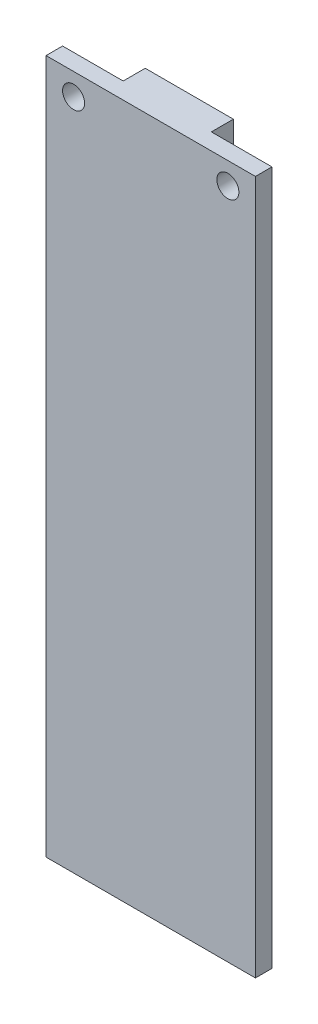
ISO-10303-21;
HEADER;
FILE_DESCRIPTION(('STEP AP214'),'2;1');
FILE_NAME('part.step','',(''),(''),'','','');
FILE_SCHEMA(('AUTOMOTIVE_DESIGN { 1 0 10303 214 1 1 1 1 }'));
ENDSEC;
DATA;
#1=APPLICATION_CONTEXT('core data for automotive mechanical design processes');
#2=APPLICATION_PROTOCOL_DEFINITION('international standard','automotive_design',2000,#1);
#3=PRODUCT_CONTEXT('',#1,'mechanical');
#4=PRODUCT('Part','Part','',(#3));
#5=PRODUCT_RELATED_PRODUCT_CATEGORY('part','',(#4));
#6=PRODUCT_DEFINITION_FORMATION('','',#4);
#7=PRODUCT_DEFINITION_CONTEXT('part definition',#1,'design');
#8=PRODUCT_DEFINITION('design','',#6,#7);
#9=PRODUCT_DEFINITION_SHAPE('','',#8);
#10=(LENGTH_UNIT() NAMED_UNIT(*) SI_UNIT(.MILLI.,.METRE.));
#11=(NAMED_UNIT(*) PLANE_ANGLE_UNIT() SI_UNIT($,.RADIAN.));
#12=(NAMED_UNIT(*) SI_UNIT($,.STERADIAN.) SOLID_ANGLE_UNIT());
#13=UNCERTAINTY_MEASURE_WITH_UNIT(LENGTH_MEASURE(1.E-05),#10,'distance_accuracy_value','');
#14=(GEOMETRIC_REPRESENTATION_CONTEXT(3) GLOBAL_UNCERTAINTY_ASSIGNED_CONTEXT((#13)) GLOBAL_UNIT_ASSIGNED_CONTEXT((#10,
#11,#12)) REPRESENTATION_CONTEXT('',''));
#15=CARTESIAN_POINT('',(0.,0.,0.));
#16=DIRECTION('',(0.,0.,1.));
#17=DIRECTION('',(1.,0.,0.));
#18=AXIS2_PLACEMENT_3D('',#15,#16,#17);
#19=CARTESIAN_POINT('',(0.,0.,1.5));
#20=DIRECTION('',(0.,0.,-1.));
#21=DIRECTION('',(-1.,0.,0.));
#22=AXIS2_PLACEMENT_3D('',#19,#20,#21);
#23=PLANE('',#22);
#24=DIRECTION('',(0.,1.,0.));
#25=VECTOR('',#24,1.);
#26=CARTESIAN_POINT('',(9.50000000000001,-31.5,1.5));
#27=LINE('',#26,#25);
#28=CARTESIAN_POINT('',(9.50000000000001,-31.5,1.5));
#29=VERTEX_POINT('',#28);
#30=CARTESIAN_POINT('',(9.50000000000001,31.5,1.5));
#31=VERTEX_POINT('',#30);
#32=EDGE_CURVE('E154',#29,#31,#27,.T.);
#33=ORIENTED_EDGE('',*,*,#32,.T.);
#34=DIRECTION('',(-1.,0.,0.));
#35=VECTOR('',#34,1.);
#36=CARTESIAN_POINT('',(-9.49999999999999,31.5,1.5));
#37=LINE('',#36,#35);
#38=CARTESIAN_POINT('',(-9.49999999999999,31.5,1.5));
#39=VERTEX_POINT('',#38);
#40=EDGE_CURVE('E157',#31,#39,#37,.T.);
#41=ORIENTED_EDGE('',*,*,#40,.T.);
#42=DIRECTION('',(0.,-1.,0.));
#43=VECTOR('',#42,1.);
#44=CARTESIAN_POINT('',(-9.49999999999999,-31.5,1.5));
#45=LINE('',#44,#43);
#46=CARTESIAN_POINT('',(-9.49999999999999,-31.5,1.5));
#47=VERTEX_POINT('',#46);
#48=EDGE_CURVE('E160',#39,#47,#45,.T.);
#49=ORIENTED_EDGE('',*,*,#48,.T.);
#50=DIRECTION('',(1.,0.,0.));
#51=VECTOR('',#50,1.);
#52=CARTESIAN_POINT('',(-9.49999999999999,-31.5,1.5));
#53=LINE('',#52,#51);
#54=EDGE_CURVE('E162',#47,#29,#53,.T.);
#55=ORIENTED_EDGE('',*,*,#54,.T.);
#56=EDGE_LOOP('',(#33,#41,#49,#55));
#57=FACE_BOUND('',#56,.T.);
#58=CARTESIAN_POINT('',(-7.,29.5,1.5));
#59=DIRECTION('',(0.,0.,1.));
#60=DIRECTION('',(1.,0.,0.));
#61=AXIS2_PLACEMENT_3D('',#58,#59,#60);
#62=CIRCLE('',#61,1.);
#63=CARTESIAN_POINT('',(-6.,29.5,1.5));
#64=VERTEX_POINT('',#63);
#65=EDGE_CURVE('E148',#64,#64,#62,.T.);
#66=ORIENTED_EDGE('',*,*,#65,.F.);
#67=EDGE_LOOP('',(#66));
#68=FACE_BOUND('',#67,.T.);
#69=CARTESIAN_POINT('',(7.,29.5,1.5));
#70=DIRECTION('',(0.,0.,1.));
#71=DIRECTION('',(-1.,0.,0.));
#72=AXIS2_PLACEMENT_3D('',#69,#70,#71);
#73=CIRCLE('',#72,1.);
#74=CARTESIAN_POINT('',(6.,29.5,1.5));
#75=VERTEX_POINT('',#74);
#76=EDGE_CURVE('E139',#75,#75,#73,.T.);
#77=ORIENTED_EDGE('',*,*,#76,.F.);
#78=EDGE_LOOP('',(#77));
#79=FACE_BOUND('',#78,.T.);
#80=ADVANCED_FACE('F37',(#57,#68,#79),#23,.F.);
#81=CARTESIAN_POINT('',(0.,0.,0.));
#82=DIRECTION('',(0.,0.,-1.));
#83=DIRECTION('',(-1.,0.,0.));
#84=AXIS2_PLACEMENT_3D('',#81,#82,#83);
#85=PLANE('',#84);
#86=DIRECTION('',(0.,1.,0.));
#87=VECTOR('',#86,1.);
#88=CARTESIAN_POINT('',(-4.,27.5,0.));
#89=LINE('',#88,#87);
#90=CARTESIAN_POINT('',(-4.,27.5,0.));
#91=VERTEX_POINT('',#90);
#92=CARTESIAN_POINT('',(-4.,31.5,0.));
#93=VERTEX_POINT('',#92);
#94=EDGE_CURVE('E52',#91,#93,#89,.T.);
#95=ORIENTED_EDGE('',*,*,#94,.F.);
#96=CARTESIAN_POINT('',(-3.,27.5,0.));
#97=DIRECTION('',(0.,0.,-1.));
#98=DIRECTION('',(-1.,0.,0.));
#99=AXIS2_PLACEMENT_3D('',#96,#97,#98);
#100=CIRCLE('',#99,1.);
#101=CARTESIAN_POINT('',(-2.99999999999999,26.5,0.));
#102=VERTEX_POINT('',#101);
#103=EDGE_CURVE('E56',#102,#91,#100,.T.);
#104=ORIENTED_EDGE('',*,*,#103,.F.);
#105=DIRECTION('',(-1.,0.,0.));
#106=VECTOR('',#105,1.);
#107=CARTESIAN_POINT('',(2.99999999999999,26.5,0.));
#108=LINE('',#107,#106);
#109=CARTESIAN_POINT('',(2.99999999999999,26.5,0.));
#110=VERTEX_POINT('',#109);
#111=EDGE_CURVE('E344',#110,#102,#108,.T.);
#112=ORIENTED_EDGE('',*,*,#111,.F.);
#113=CARTESIAN_POINT('',(3.,27.5,0.));
#114=DIRECTION('',(0.,0.,-1.));
#115=DIRECTION('',(-1.,0.,0.));
#116=AXIS2_PLACEMENT_3D('',#113,#114,#115);
#117=CIRCLE('',#116,1.);
#118=CARTESIAN_POINT('',(4.,27.5,0.));
#119=VERTEX_POINT('',#118);
#120=EDGE_CURVE('E347',#119,#110,#117,.T.);
#121=ORIENTED_EDGE('',*,*,#120,.F.);
#122=DIRECTION('',(0.,-1.,0.));
#123=VECTOR('',#122,1.);
#124=CARTESIAN_POINT('',(4.,31.5,0.));
#125=LINE('',#124,#123);
#126=CARTESIAN_POINT('',(4.,31.5,0.));
#127=VERTEX_POINT('',#126);
#128=EDGE_CURVE('E348',#127,#119,#125,.T.);
#129=ORIENTED_EDGE('',*,*,#128,.F.);
#130=DIRECTION('',(-1.,0.,0.));
#131=VECTOR('',#130,1.);
#132=CARTESIAN_POINT('',(-9.49999999999999,31.5,0.));
#133=LINE('',#132,#131);
#134=CARTESIAN_POINT('',(9.50000000000001,31.5,0.));
#135=VERTEX_POINT('',#134);
#136=EDGE_CURVE('E135',#135,#127,#133,.T.);
#137=ORIENTED_EDGE('',*,*,#136,.F.);
#138=DIRECTION('',(0.,1.,0.));
#139=VECTOR('',#138,1.);
#140=CARTESIAN_POINT('',(9.50000000000001,-31.5,0.));
#141=LINE('',#140,#139);
#142=CARTESIAN_POINT('',(9.50000000000001,-31.5,0.));
#143=VERTEX_POINT('',#142);
#144=EDGE_CURVE('E151',#143,#135,#141,.T.);
#145=ORIENTED_EDGE('',*,*,#144,.F.);
#146=DIRECTION('',(1.,0.,0.));
#147=VECTOR('',#146,1.);
#148=CARTESIAN_POINT('',(-9.49999999999999,-31.5,0.));
#149=LINE('',#148,#147);
#150=CARTESIAN_POINT('',(-9.49999999999999,-31.5,0.));
#151=VERTEX_POINT('',#150);
#152=EDGE_CURVE('E158',#151,#143,#149,.T.);
#153=ORIENTED_EDGE('',*,*,#152,.F.);
#154=DIRECTION('',(0.,-1.,0.));
#155=VECTOR('',#154,1.);
#156=CARTESIAN_POINT('',(-9.49999999999999,-31.5,0.));
#157=LINE('',#156,#155);
#158=CARTESIAN_POINT('',(-9.49999999999999,31.5,0.));
#159=VERTEX_POINT('',#158);
#160=EDGE_CURVE('E169',#159,#151,#157,.T.);
#161=ORIENTED_EDGE('',*,*,#160,.F.);
#162=EDGE_CURVE('E167',#93,#159,#133,.T.);
#163=ORIENTED_EDGE('',*,*,#162,.F.);
#164=EDGE_LOOP('',(#95,#104,#112,#121,#129,#137,#145,#153,#161,#163));
#165=FACE_BOUND('',#164,.T.);
#166=CARTESIAN_POINT('',(-7.,29.5,0.));
#167=DIRECTION('',(0.,0.,1.));
#168=DIRECTION('',(1.,0.,0.));
#169=AXIS2_PLACEMENT_3D('',#166,#167,#168);
#170=CIRCLE('',#169,1.);
#171=CARTESIAN_POINT('',(-6.,29.5,0.));
#172=VERTEX_POINT('',#171);
#173=EDGE_CURVE('E146',#172,#172,#170,.T.);
#174=ORIENTED_EDGE('',*,*,#173,.T.);
#175=EDGE_LOOP('',(#174));
#176=FACE_BOUND('',#175,.T.);
#177=CARTESIAN_POINT('',(7.,29.5,0.));
#178=DIRECTION('',(0.,0.,1.));
#179=DIRECTION('',(-1.,0.,0.));
#180=AXIS2_PLACEMENT_3D('',#177,#178,#179);
#181=CIRCLE('',#180,1.);
#182=CARTESIAN_POINT('',(6.,29.5,0.));
#183=VERTEX_POINT('',#182);
#184=EDGE_CURVE('E136',#183,#183,#181,.T.);
#185=ORIENTED_EDGE('',*,*,#184,.T.);
#186=EDGE_LOOP('',(#185));
#187=FACE_BOUND('',#186,.T.);
#188=ADVANCED_FACE('F184',(#165,#176,#187),#85,.T.);
#189=CARTESIAN_POINT('',(9.50000000000001,-31.5,1.5));
#190=DIRECTION('',(-1.,0.,0.));
#191=DIRECTION('',(0.,0.,1.));
#192=AXIS2_PLACEMENT_3D('',#189,#190,#191);
#193=PLANE('',#192);
#194=ORIENTED_EDGE('',*,*,#144,.T.);
#195=DIRECTION('',(0.,0.,-1.));
#196=VECTOR('',#195,1.);
#197=CARTESIAN_POINT('',(9.50000000000001,31.5,1.5));
#198=LINE('',#197,#196);
#199=EDGE_CURVE('E11',#31,#135,#198,.T.);
#200=ORIENTED_EDGE('',*,*,#199,.F.);
#201=ORIENTED_EDGE('',*,*,#32,.F.);
#202=DIRECTION('',(0.,0.,-1.));
#203=VECTOR('',#202,1.);
#204=CARTESIAN_POINT('',(9.50000000000001,-31.5,1.5));
#205=LINE('',#204,#203);
#206=EDGE_CURVE('E164',#29,#143,#205,.T.);
#207=ORIENTED_EDGE('',*,*,#206,.T.);
#208=EDGE_LOOP('',(#194,#200,#201,#207));
#209=FACE_BOUND('',#208,.T.);
#210=ADVANCED_FACE('F39',(#209),#193,.F.);
#211=CARTESIAN_POINT('',(-9.49999999999999,31.5,1.5));
#212=DIRECTION('',(0.,-1.,0.));
#213=DIRECTION('',(0.,0.,-1.));
#214=AXIS2_PLACEMENT_3D('',#211,#212,#213);
#215=PLANE('',#214);
#216=ORIENTED_EDGE('',*,*,#136,.T.);
#217=DIRECTION('',(0.,0.,1.));
#218=VECTOR('',#217,1.);
#219=CARTESIAN_POINT('',(4.,31.5,-2.));
#220=LINE('',#219,#218);
#221=CARTESIAN_POINT('',(4.,31.5,-2.));
#222=VERTEX_POINT('',#221);
#223=EDGE_CURVE('E117',#222,#127,#220,.T.);
#224=ORIENTED_EDGE('',*,*,#223,.F.);
#225=DIRECTION('',(1.,0.,0.));
#226=VECTOR('',#225,1.);
#227=CARTESIAN_POINT('',(-4.,31.5,-2.));
#228=LINE('',#227,#226);
#229=CARTESIAN_POINT('',(-4.,31.5,-2.));
#230=VERTEX_POINT('',#229);
#231=EDGE_CURVE('E123',#230,#222,#228,.T.);
#232=ORIENTED_EDGE('',*,*,#231,.F.);
#233=DIRECTION('',(0.,0.,1.));
#234=VECTOR('',#233,1.);
#235=CARTESIAN_POINT('',(-4.,31.5,-2.));
#236=LINE('',#235,#234);
#237=EDGE_CURVE('E328',#230,#93,#236,.T.);
#238=ORIENTED_EDGE('',*,*,#237,.T.);
#239=ORIENTED_EDGE('',*,*,#162,.T.);
#240=DIRECTION('',(0.,0.,-1.));
#241=VECTOR('',#240,1.);
#242=CARTESIAN_POINT('',(-9.49999999999999,31.5,1.5));
#243=LINE('',#242,#241);
#244=EDGE_CURVE('E45',#39,#159,#243,.T.);
#245=ORIENTED_EDGE('',*,*,#244,.F.);
#246=ORIENTED_EDGE('',*,*,#40,.F.);
#247=ORIENTED_EDGE('',*,*,#199,.T.);
#248=EDGE_LOOP('',(#216,#224,#232,#238,#239,#245,#246,#247));
#249=FACE_BOUND('',#248,.T.);
#250=ADVANCED_FACE('F134',(#249),#215,.F.);
#251=CARTESIAN_POINT('',(-9.49999999999999,-31.5,1.5));
#252=DIRECTION('',(1.,0.,0.));
#253=DIRECTION('',(0.,0.,-1.));
#254=AXIS2_PLACEMENT_3D('',#251,#252,#253);
#255=PLANE('',#254);
#256=ORIENTED_EDGE('',*,*,#160,.T.);
#257=DIRECTION('',(0.,0.,-1.));
#258=VECTOR('',#257,1.);
#259=CARTESIAN_POINT('',(-9.49999999999999,-31.5,1.5));
#260=LINE('',#259,#258);
#261=EDGE_CURVE('E174',#47,#151,#260,.T.);
#262=ORIENTED_EDGE('',*,*,#261,.F.);
#263=ORIENTED_EDGE('',*,*,#48,.F.);
#264=ORIENTED_EDGE('',*,*,#244,.T.);
#265=EDGE_LOOP('',(#256,#262,#263,#264));
#266=FACE_BOUND('',#265,.T.);
#267=ADVANCED_FACE('F181',(#266),#255,.F.);
#268=CARTESIAN_POINT('',(-9.49999999999999,-31.5,1.5));
#269=DIRECTION('',(0.,1.,0.));
#270=DIRECTION('',(0.,0.,1.));
#271=AXIS2_PLACEMENT_3D('',#268,#269,#270);
#272=PLANE('',#271);
#273=ORIENTED_EDGE('',*,*,#152,.T.);
#274=ORIENTED_EDGE('',*,*,#206,.F.);
#275=ORIENTED_EDGE('',*,*,#54,.F.);
#276=ORIENTED_EDGE('',*,*,#261,.T.);
#277=EDGE_LOOP('',(#273,#274,#275,#276));
#278=FACE_BOUND('',#277,.T.);
#279=ADVANCED_FACE('F189',(#278),#272,.F.);
#280=CARTESIAN_POINT('',(-7.,29.5,1.5));
#281=DIRECTION('',(0.,0.,-1.));
#282=DIRECTION('',(-1.,0.,0.));
#283=AXIS2_PLACEMENT_3D('',#280,#281,#282);
#284=CYLINDRICAL_SURFACE('',#283,1.);
#285=ORIENTED_EDGE('',*,*,#65,.T.);
#286=EDGE_LOOP('',(#285));
#287=FACE_BOUND('',#286,.T.);
#288=ORIENTED_EDGE('',*,*,#173,.F.);
#289=EDGE_LOOP('',(#288));
#290=FACE_BOUND('',#289,.T.);
#291=ADVANCED_FACE('F205',(#287,#290),#284,.F.);
#292=CARTESIAN_POINT('',(7.,29.5,1.5));
#293=DIRECTION('',(0.,0.,-1.));
#294=DIRECTION('',(-1.,0.,0.));
#295=AXIS2_PLACEMENT_3D('',#292,#293,#294);
#296=CYLINDRICAL_SURFACE('',#295,1.);
#297=ORIENTED_EDGE('',*,*,#76,.T.);
#298=EDGE_LOOP('',(#297));
#299=FACE_BOUND('',#298,.T.);
#300=ORIENTED_EDGE('',*,*,#184,.F.);
#301=EDGE_LOOP('',(#300));
#302=FACE_BOUND('',#301,.T.);
#303=ADVANCED_FACE('F202',(#299,#302),#296,.F.);
#304=CARTESIAN_POINT('',(4.,31.5,-2.));
#305=DIRECTION('',(-1.,0.,0.));
#306=DIRECTION('',(0.,0.,1.));
#307=AXIS2_PLACEMENT_3D('',#304,#305,#306);
#308=PLANE('',#307);
#309=ORIENTED_EDGE('',*,*,#128,.T.);
#310=DIRECTION('',(0.,0.,1.));
#311=VECTOR('',#310,1.);
#312=CARTESIAN_POINT('',(4.,27.5,-2.));
#313=LINE('',#312,#311);
#314=CARTESIAN_POINT('',(4.,27.5,-2.));
#315=VERTEX_POINT('',#314);
#316=EDGE_CURVE('E119',#315,#119,#313,.T.);
#317=ORIENTED_EDGE('',*,*,#316,.F.);
#318=DIRECTION('',(0.,-1.,0.));
#319=VECTOR('',#318,1.);
#320=CARTESIAN_POINT('',(4.,31.5,-2.));
#321=LINE('',#320,#319);
#322=EDGE_CURVE('E112',#222,#315,#321,.T.);
#323=ORIENTED_EDGE('',*,*,#322,.F.);
#324=ORIENTED_EDGE('',*,*,#223,.T.);
#325=EDGE_LOOP('',(#309,#317,#323,#324));
#326=FACE_BOUND('',#325,.T.);
#327=ADVANCED_FACE('F115',(#326),#308,.F.);
#328=CARTESIAN_POINT('',(3.,27.5,-2.));
#329=DIRECTION('',(0.,0.,1.));
#330=DIRECTION('',(1.,0.,0.));
#331=AXIS2_PLACEMENT_3D('',#328,#329,#330);
#332=CYLINDRICAL_SURFACE('',#331,1.);
#333=ORIENTED_EDGE('',*,*,#120,.T.);
#334=DIRECTION('',(0.,0.,1.));
#335=VECTOR('',#334,1.);
#336=CARTESIAN_POINT('',(2.99999999999999,26.5,-2.));
#337=LINE('',#336,#335);
#338=CARTESIAN_POINT('',(2.99999999999999,26.5,-2.));
#339=VERTEX_POINT('',#338);
#340=EDGE_CURVE('E141',#339,#110,#337,.T.);
#341=ORIENTED_EDGE('',*,*,#340,.F.);
#342=CARTESIAN_POINT('',(3.,27.5,-2.));
#343=DIRECTION('',(0.,0.,-1.));
#344=DIRECTION('',(-1.,0.,0.));
#345=AXIS2_PLACEMENT_3D('',#342,#343,#344);
#346=CIRCLE('',#345,1.);
#347=EDGE_CURVE('E122',#315,#339,#346,.T.);
#348=ORIENTED_EDGE('',*,*,#347,.F.);
#349=ORIENTED_EDGE('',*,*,#316,.T.);
#350=EDGE_LOOP('',(#333,#341,#348,#349));
#351=FACE_BOUND('',#350,.T.);
#352=ADVANCED_FACE('F248',(#351),#332,.T.);
#353=CARTESIAN_POINT('',(2.99999999999999,26.5,-2.));
#354=DIRECTION('',(0.,1.,0.));
#355=DIRECTION('',(0.,0.,1.));
#356=AXIS2_PLACEMENT_3D('',#353,#354,#355);
#357=PLANE('',#356);
#358=ORIENTED_EDGE('',*,*,#111,.T.);
#359=DIRECTION('',(0.,0.,1.));
#360=VECTOR('',#359,1.);
#361=CARTESIAN_POINT('',(-2.99999999999999,26.5,-2.));
#362=LINE('',#361,#360);
#363=CARTESIAN_POINT('',(-2.99999999999999,26.5,-2.));
#364=VERTEX_POINT('',#363);
#365=EDGE_CURVE('E333',#364,#102,#362,.T.);
#366=ORIENTED_EDGE('',*,*,#365,.F.);
#367=DIRECTION('',(-1.,0.,0.));
#368=VECTOR('',#367,1.);
#369=CARTESIAN_POINT('',(2.99999999999999,26.5,-2.));
#370=LINE('',#369,#368);
#371=EDGE_CURVE('E345',#339,#364,#370,.T.);
#372=ORIENTED_EDGE('',*,*,#371,.F.);
#373=ORIENTED_EDGE('',*,*,#340,.T.);
#374=EDGE_LOOP('',(#358,#366,#372,#373));
#375=FACE_BOUND('',#374,.T.);
#376=ADVANCED_FACE('F255',(#375),#357,.F.);
#377=CARTESIAN_POINT('',(-3.,27.5,-2.));
#378=DIRECTION('',(0.,0.,1.));
#379=DIRECTION('',(1.,0.,0.));
#380=AXIS2_PLACEMENT_3D('',#377,#378,#379);
#381=CYLINDRICAL_SURFACE('',#380,1.);
#382=ORIENTED_EDGE('',*,*,#103,.T.);
#383=DIRECTION('',(0.,0.,1.));
#384=VECTOR('',#383,1.);
#385=CARTESIAN_POINT('',(-4.,27.5,-2.));
#386=LINE('',#385,#384);
#387=CARTESIAN_POINT('',(-4.,27.5,-2.));
#388=VERTEX_POINT('',#387);
#389=EDGE_CURVE('E330',#388,#91,#386,.T.);
#390=ORIENTED_EDGE('',*,*,#389,.F.);
#391=CARTESIAN_POINT('',(-3.,27.5,-2.));
#392=DIRECTION('',(0.,0.,-1.));
#393=DIRECTION('',(-1.,0.,0.));
#394=AXIS2_PLACEMENT_3D('',#391,#392,#393);
#395=CIRCLE('',#394,1.);
#396=EDGE_CURVE('E335',#364,#388,#395,.T.);
#397=ORIENTED_EDGE('',*,*,#396,.F.);
#398=ORIENTED_EDGE('',*,*,#365,.T.);
#399=EDGE_LOOP('',(#382,#390,#397,#398));
#400=FACE_BOUND('',#399,.T.);
#401=ADVANCED_FACE('F263',(#400),#381,.T.);
#402=CARTESIAN_POINT('',(-4.,27.5,-2.));
#403=DIRECTION('',(1.,0.,0.));
#404=DIRECTION('',(0.,0.,-1.));
#405=AXIS2_PLACEMENT_3D('',#402,#403,#404);
#406=PLANE('',#405);
#407=ORIENTED_EDGE('',*,*,#94,.T.);
#408=ORIENTED_EDGE('',*,*,#237,.F.);
#409=DIRECTION('',(0.,1.,0.));
#410=VECTOR('',#409,1.);
#411=CARTESIAN_POINT('',(-4.,27.5,-2.));
#412=LINE('',#411,#410);
#413=EDGE_CURVE('E128',#388,#230,#412,.T.);
#414=ORIENTED_EDGE('',*,*,#413,.F.);
#415=ORIENTED_EDGE('',*,*,#389,.T.);
#416=EDGE_LOOP('',(#407,#408,#414,#415));
#417=FACE_BOUND('',#416,.T.);
#418=ADVANCED_FACE('F271',(#417),#406,.F.);
#419=CARTESIAN_POINT('',(3.,27.5,-2.));
#420=DIRECTION('',(0.,0.,-1.));
#421=DIRECTION('',(-1.,0.,0.));
#422=AXIS2_PLACEMENT_3D('',#419,#420,#421);
#423=PLANE('',#422);
#424=ORIENTED_EDGE('',*,*,#231,.T.);
#425=ORIENTED_EDGE('',*,*,#322,.T.);
#426=ORIENTED_EDGE('',*,*,#347,.T.);
#427=ORIENTED_EDGE('',*,*,#371,.T.);
#428=ORIENTED_EDGE('',*,*,#396,.T.);
#429=ORIENTED_EDGE('',*,*,#413,.T.);
#430=EDGE_LOOP('',(#424,#425,#426,#427,#428,#429));
#431=FACE_BOUND('',#430,.T.);
#432=ADVANCED_FACE('F126',(#431),#423,.T.);
#433=CLOSED_SHELL('',(#80,#188,#210,#250,#267,#279,#291,#303,#327,#352,#376,#401,#418,#432));
#434=MANIFOLD_SOLID_BREP('B2',#433);
#435=ADVANCED_BREP_SHAPE_REPRESENTATION('',(#18,#434),#14);
#436=SHAPE_DEFINITION_REPRESENTATION(#9,#435);
ENDSEC;
END-ISO-10303-21;
